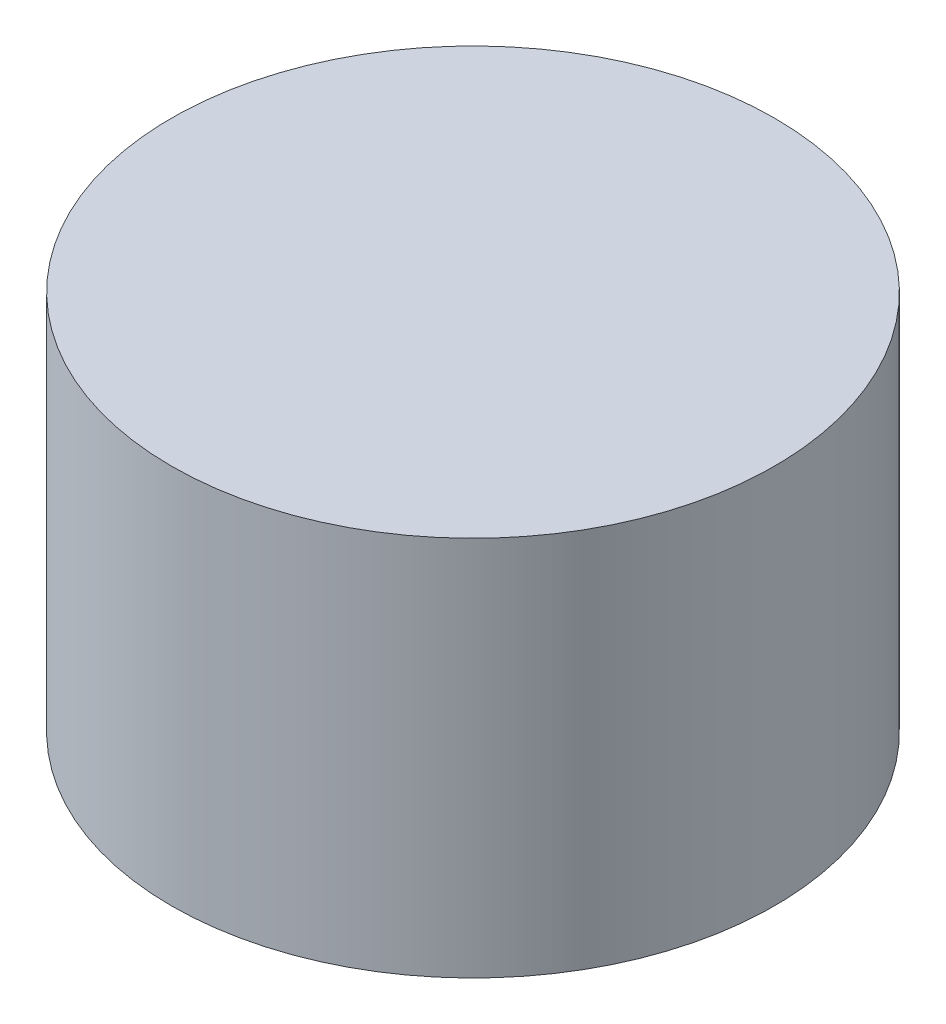
ISO-10303-21;
HEADER;
FILE_DESCRIPTION(('STEP AP214'),'2;1');
FILE_NAME('part.step','',(''),(''),'','','');
FILE_SCHEMA(('AUTOMOTIVE_DESIGN { 1 0 10303 214 1 1 1 1 }'));
ENDSEC;
DATA;
#1=APPLICATION_CONTEXT('core data for automotive mechanical design processes');
#2=APPLICATION_PROTOCOL_DEFINITION('international standard','automotive_design',2000,#1);
#3=PRODUCT_CONTEXT('',#1,'mechanical');
#4=PRODUCT('Part','Part','',(#3));
#5=PRODUCT_RELATED_PRODUCT_CATEGORY('part','',(#4));
#6=PRODUCT_DEFINITION_FORMATION('','',#4);
#7=PRODUCT_DEFINITION_CONTEXT('part definition',#1,'design');
#8=PRODUCT_DEFINITION('design','',#6,#7);
#9=PRODUCT_DEFINITION_SHAPE('','',#8);
#10=(LENGTH_UNIT() NAMED_UNIT(*) SI_UNIT(.MILLI.,.METRE.));
#11=(NAMED_UNIT(*) PLANE_ANGLE_UNIT() SI_UNIT($,.RADIAN.));
#12=(NAMED_UNIT(*) SI_UNIT($,.STERADIAN.) SOLID_ANGLE_UNIT());
#13=UNCERTAINTY_MEASURE_WITH_UNIT(LENGTH_MEASURE(1.E-05),#10,'distance_accuracy_value','');
#14=(GEOMETRIC_REPRESENTATION_CONTEXT(3) GLOBAL_UNCERTAINTY_ASSIGNED_CONTEXT((#13)) GLOBAL_UNIT_ASSIGNED_CONTEXT((#10,
#11,#12)) REPRESENTATION_CONTEXT('',''));
#15=CARTESIAN_POINT('',(0.,0.,0.));
#16=DIRECTION('',(0.,0.,1.));
#17=DIRECTION('',(1.,0.,0.));
#18=AXIS2_PLACEMENT_3D('',#15,#16,#17);
#19=CARTESIAN_POINT('',(0.,6.,0.));
#20=DIRECTION('',(0.,-1.,0.));
#21=DIRECTION('',(0.,0.,-1.));
#22=AXIS2_PLACEMENT_3D('',#19,#20,#21);
#23=CYLINDRICAL_SURFACE('',#22,4.75);
#24=CARTESIAN_POINT('',(0.,6.,0.));
#25=DIRECTION('',(0.,1.,0.));
#26=DIRECTION('',(0.,0.,1.));
#27=AXIS2_PLACEMENT_3D('',#24,#25,#26);
#28=CIRCLE('',#27,4.75);
#29=CARTESIAN_POINT('',(0.,6.,4.75));
#30=VERTEX_POINT('',#29);
#31=EDGE_CURVE('E10',#30,#30,#28,.T.);
#32=ORIENTED_EDGE('',*,*,#31,.F.);
#33=EDGE_LOOP('',(#32));
#34=FACE_BOUND('',#33,.T.);
#35=CARTESIAN_POINT('',(0.,0.,0.));
#36=DIRECTION('',(0.,1.,0.));
#37=DIRECTION('',(0.,0.,1.));
#38=AXIS2_PLACEMENT_3D('',#35,#36,#37);
#39=CIRCLE('',#38,4.75);
#40=CARTESIAN_POINT('',(0.,0.,4.75));
#41=VERTEX_POINT('',#40);
#42=EDGE_CURVE('E34',#41,#41,#39,.T.);
#43=ORIENTED_EDGE('',*,*,#42,.T.);
#44=EDGE_LOOP('',(#43));
#45=FACE_BOUND('',#44,.T.);
#46=ADVANCED_FACE('F31',(#34,#45),#23,.T.);
#47=CARTESIAN_POINT('',(0.,6.,0.));
#48=DIRECTION('',(0.,1.,0.));
#49=DIRECTION('',(0.,0.,1.));
#50=AXIS2_PLACEMENT_3D('',#47,#48,#49);
#51=PLANE('',#50);
#52=ORIENTED_EDGE('',*,*,#31,.T.);
#53=EDGE_LOOP('',(#52));
#54=FACE_BOUND('',#53,.T.);
#55=ADVANCED_FACE('F46',(#54),#51,.T.);
#56=CARTESIAN_POINT('',(0.,0.,0.));
#57=DIRECTION('',(0.,1.,0.));
#58=DIRECTION('',(0.,0.,1.));
#59=AXIS2_PLACEMENT_3D('',#56,#57,#58);
#60=PLANE('',#59);
#61=ORIENTED_EDGE('',*,*,#42,.F.);
#62=EDGE_LOOP('',(#61));
#63=FACE_BOUND('',#62,.T.);
#64=ADVANCED_FACE('F44',(#63),#60,.F.);
#65=CLOSED_SHELL('',(#46,#55,#64));
#66=MANIFOLD_SOLID_BREP('B2',#65);
#67=ADVANCED_BREP_SHAPE_REPRESENTATION('',(#18,#66),#14);
#68=SHAPE_DEFINITION_REPRESENTATION(#9,#67);
ENDSEC;
END-ISO-10303-21;
